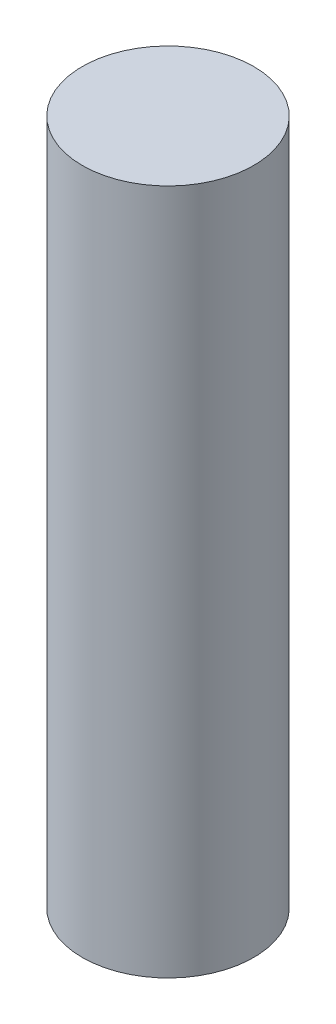
ISO-10303-21;
HEADER;
FILE_DESCRIPTION(('STEP AP214'),'2;1');
FILE_NAME('part.step','',(''),(''),'','','');
FILE_SCHEMA(('AUTOMOTIVE_DESIGN { 1 0 10303 214 1 1 1 1 }'));
ENDSEC;
DATA;
#1=APPLICATION_CONTEXT('core data for automotive mechanical design processes');
#2=APPLICATION_PROTOCOL_DEFINITION('international standard','automotive_design',2000,#1);
#3=PRODUCT_CONTEXT('',#1,'mechanical');
#4=PRODUCT('Part','Part','',(#3));
#5=PRODUCT_RELATED_PRODUCT_CATEGORY('part','',(#4));
#6=PRODUCT_DEFINITION_FORMATION('','',#4);
#7=PRODUCT_DEFINITION_CONTEXT('part definition',#1,'design');
#8=PRODUCT_DEFINITION('design','',#6,#7);
#9=PRODUCT_DEFINITION_SHAPE('','',#8);
#10=(LENGTH_UNIT() NAMED_UNIT(*) SI_UNIT(.MILLI.,.METRE.));
#11=(NAMED_UNIT(*) PLANE_ANGLE_UNIT() SI_UNIT($,.RADIAN.));
#12=(NAMED_UNIT(*) SI_UNIT($,.STERADIAN.) SOLID_ANGLE_UNIT());
#13=UNCERTAINTY_MEASURE_WITH_UNIT(LENGTH_MEASURE(1.E-05),#10,'distance_accuracy_value','');
#14=(GEOMETRIC_REPRESENTATION_CONTEXT(3) GLOBAL_UNCERTAINTY_ASSIGNED_CONTEXT((#13)) GLOBAL_UNIT_ASSIGNED_CONTEXT((#10,
#11,#12)) REPRESENTATION_CONTEXT('',''));
#15=CARTESIAN_POINT('',(0.,0.,0.));
#16=DIRECTION('',(0.,0.,1.));
#17=DIRECTION('',(1.,0.,0.));
#18=AXIS2_PLACEMENT_3D('',#15,#16,#17);
#19=CARTESIAN_POINT('',(0.,12.,0.));
#20=DIRECTION('',(0.,-1.,0.));
#21=DIRECTION('',(0.,0.,-1.));
#22=AXIS2_PLACEMENT_3D('',#19,#20,#21);
#23=CYLINDRICAL_SURFACE('',#22,3.);
#24=CARTESIAN_POINT('',(0.,12.,0.));
#25=DIRECTION('',(0.,1.,0.));
#26=DIRECTION('',(0.,0.,1.));
#27=AXIS2_PLACEMENT_3D('',#24,#25,#26);
#28=CIRCLE('',#27,3.);
#29=CARTESIAN_POINT('',(0.,12.,3.));
#30=VERTEX_POINT('',#29);
#31=EDGE_CURVE('E10',#30,#30,#28,.T.);
#32=ORIENTED_EDGE('',*,*,#31,.F.);
#33=EDGE_LOOP('',(#32));
#34=FACE_BOUND('',#33,.T.);
#35=CARTESIAN_POINT('',(0.,-12.,0.));
#36=DIRECTION('',(0.,1.,0.));
#37=DIRECTION('',(0.,0.,1.));
#38=AXIS2_PLACEMENT_3D('',#35,#36,#37);
#39=CIRCLE('',#38,3.);
#40=CARTESIAN_POINT('',(0.,-12.,3.));
#41=VERTEX_POINT('',#40);
#42=EDGE_CURVE('E34',#41,#41,#39,.T.);
#43=ORIENTED_EDGE('',*,*,#42,.T.);
#44=EDGE_LOOP('',(#43));
#45=FACE_BOUND('',#44,.T.);
#46=ADVANCED_FACE('F31',(#34,#45),#23,.T.);
#47=CARTESIAN_POINT('',(0.,12.,0.));
#48=DIRECTION('',(0.,1.,0.));
#49=DIRECTION('',(0.,0.,1.));
#50=AXIS2_PLACEMENT_3D('',#47,#48,#49);
#51=PLANE('',#50);
#52=ORIENTED_EDGE('',*,*,#31,.T.);
#53=EDGE_LOOP('',(#52));
#54=FACE_BOUND('',#53,.T.);
#55=ADVANCED_FACE('F46',(#54),#51,.T.);
#56=CARTESIAN_POINT('',(0.,-12.,0.));
#57=DIRECTION('',(0.,1.,0.));
#58=DIRECTION('',(0.,0.,1.));
#59=AXIS2_PLACEMENT_3D('',#56,#57,#58);
#60=PLANE('',#59);
#61=ORIENTED_EDGE('',*,*,#42,.F.);
#62=EDGE_LOOP('',(#61));
#63=FACE_BOUND('',#62,.T.);
#64=ADVANCED_FACE('F44',(#63),#60,.F.);
#65=CLOSED_SHELL('',(#46,#55,#64));
#66=MANIFOLD_SOLID_BREP('B2',#65);
#67=ADVANCED_BREP_SHAPE_REPRESENTATION('',(#18,#66),#14);
#68=SHAPE_DEFINITION_REPRESENTATION(#9,#67);
ENDSEC;
END-ISO-10303-21;
